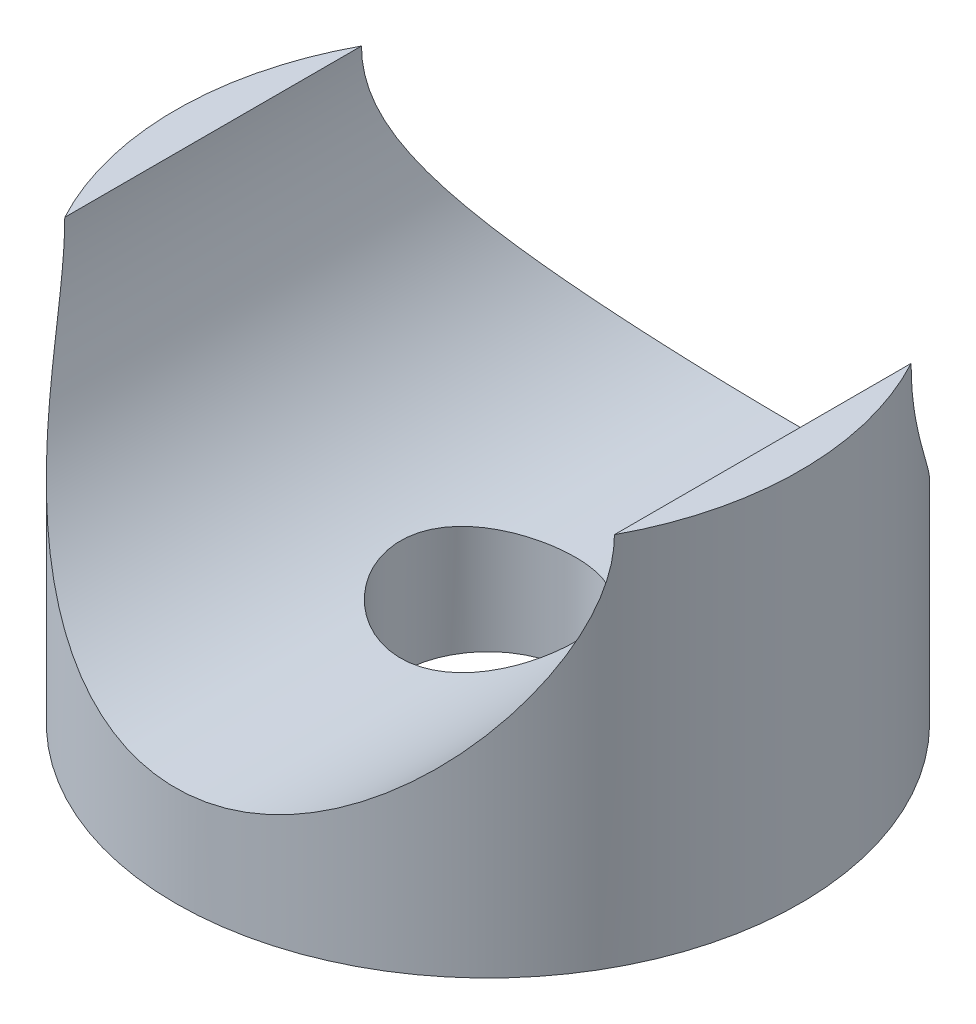
ISO-10303-21;
HEADER;
FILE_DESCRIPTION(('STEP AP214'),'2;1');
FILE_NAME('part.step','',(''),(''),'','','');
FILE_SCHEMA(('AUTOMOTIVE_DESIGN { 1 0 10303 214 1 1 1 1 }'));
ENDSEC;
DATA;
#1=APPLICATION_CONTEXT('core data for automotive mechanical design processes');
#2=APPLICATION_PROTOCOL_DEFINITION('international standard','automotive_design',2000,#1);
#3=PRODUCT_CONTEXT('',#1,'mechanical');
#4=PRODUCT('Part','Part','',(#3));
#5=PRODUCT_RELATED_PRODUCT_CATEGORY('part','',(#4));
#6=PRODUCT_DEFINITION_FORMATION('','',#4);
#7=PRODUCT_DEFINITION_CONTEXT('part definition',#1,'design');
#8=PRODUCT_DEFINITION('design','',#6,#7);
#9=PRODUCT_DEFINITION_SHAPE('','',#8);
#10=(LENGTH_UNIT() NAMED_UNIT(*) SI_UNIT(.MILLI.,.METRE.));
#11=(NAMED_UNIT(*) PLANE_ANGLE_UNIT() SI_UNIT($,.RADIAN.));
#12=(NAMED_UNIT(*) SI_UNIT($,.STERADIAN.) SOLID_ANGLE_UNIT());
#13=UNCERTAINTY_MEASURE_WITH_UNIT(LENGTH_MEASURE(1.E-05),#10,'distance_accuracy_value','');
#14=(GEOMETRIC_REPRESENTATION_CONTEXT(3) GLOBAL_UNCERTAINTY_ASSIGNED_CONTEXT((#13)) GLOBAL_UNIT_ASSIGNED_CONTEXT((#10,
#11,#12)) REPRESENTATION_CONTEXT('',''));
#15=CARTESIAN_POINT('',(0.,0.,0.));
#16=DIRECTION('',(0.,0.,1.));
#17=DIRECTION('',(1.,0.,0.));
#18=AXIS2_PLACEMENT_3D('',#15,#16,#17);
#19=CARTESIAN_POINT('',(0.,15.,0.));
#20=DIRECTION('',(0.,1.,0.));
#21=DIRECTION('',(0.,0.,1.));
#22=AXIS2_PLACEMENT_3D('',#19,#20,#21);
#23=PLANE('',#22);
#24=CARTESIAN_POINT('',(0.,15.,0.));
#25=DIRECTION('',(0.,1.,0.));
#26=DIRECTION('',(0.,0.,1.));
#27=AXIS2_PLACEMENT_3D('',#24,#25,#26);
#28=CIRCLE('',#27,12.5);
#29=CARTESIAN_POINT('',(11.,15.,5.93717104351896));
#30=VERTEX_POINT('',#29);
#31=CARTESIAN_POINT('',(11.,15.,-5.93717104351896));
#32=VERTEX_POINT('',#31);
#33=EDGE_CURVE('E11',#30,#32,#28,.T.);
#34=ORIENTED_EDGE('',*,*,#33,.T.);
#35=DIRECTION('',(0.,0.,-1.));
#36=VECTOR('',#35,1.);
#37=CARTESIAN_POINT('',(11.,15.,22.));
#38=LINE('',#37,#36);
#39=EDGE_CURVE('E67',#32,#30,#38,.F.);
#40=ORIENTED_EDGE('',*,*,#39,.T.);
#41=EDGE_LOOP('',(#34,#40));
#42=FACE_BOUND('',#41,.T.);
#43=ADVANCED_FACE('F43',(#42),#23,.T.);
#44=CARTESIAN_POINT('',(-11.,15.,-5.93717104351896));
#45=VERTEX_POINT('',#44);
#46=CARTESIAN_POINT('',(-11.,15.,5.93717104351896));
#47=VERTEX_POINT('',#46);
#48=EDGE_CURVE('E59',#45,#47,#28,.T.);
#49=ORIENTED_EDGE('',*,*,#48,.T.);
#50=DIRECTION('',(0.,0.,-1.));
#51=VECTOR('',#50,1.);
#52=CARTESIAN_POINT('',(-11.,15.,22.));
#53=LINE('',#52,#51);
#54=EDGE_CURVE('E79',#47,#45,#53,.T.);
#55=ORIENTED_EDGE('',*,*,#54,.T.);
#56=EDGE_LOOP('',(#49,#55));
#57=FACE_BOUND('',#56,.T.);
#58=ADVANCED_FACE('F87',(#57),#23,.T.);
#59=CARTESIAN_POINT('',(0.,15.,0.));
#60=DIRECTION('',(0.,-1.,0.));
#61=DIRECTION('',(0.,0.,-1.));
#62=AXIS2_PLACEMENT_3D('',#59,#60,#61);
#63=CYLINDRICAL_SURFACE('',#62,12.5);
#64=CARTESIAN_POINT('',(0.,0.,0.));
#65=DIRECTION('',(0.,1.,0.));
#66=DIRECTION('',(0.,0.,1.));
#67=AXIS2_PLACEMENT_3D('',#64,#65,#66);
#68=CIRCLE('',#67,12.5);
#69=CARTESIAN_POINT('',(0.,0.,12.5));
#70=VERTEX_POINT('',#69);
#71=EDGE_CURVE('E91',#70,#70,#68,.T.);
#72=ORIENTED_EDGE('',*,*,#71,.T.);
#73=EDGE_LOOP('',(#72));
#74=FACE_BOUND('',#73,.T.);
#75=CARTESIAN_POINT('',(-11.,15.,5.93717104351896));
#76=CARTESIAN_POINT('',(-11.0000435491848,14.8231963740313,5.93701480647454));
#77=CARTESIAN_POINT('',(-10.9957394278329,14.6464972505732,5.94506501443922));
#78=CARTESIAN_POINT('',(-10.978794113798,14.2952603105016,5.9763390350787));
#79=CARTESIAN_POINT('',(-10.9661729018585,14.1207183328762,5.99952648123605));
#80=CARTESIAN_POINT('',(-10.9332301828328,13.7778178667968,6.05933530603669));
#81=CARTESIAN_POINT('',(-10.9130428218675,13.6094047145475,6.09572231769166));
#82=CARTESIAN_POINT('',(-10.8654430284725,13.2765056799291,6.18017089159592));
#83=CARTESIAN_POINT('',(-10.8380257408056,13.1120225179928,6.22824029741824));
#84=CARTESIAN_POINT('',(-10.762282729134,12.7127558286128,6.35855617523171));
#85=CARTESIAN_POINT('',(-10.7101442109561,12.4805059049969,6.44634426789699));
#86=CARTESIAN_POINT('',(-10.5929007795773,12.0258364614429,6.63724370069664));
#87=CARTESIAN_POINT('',(-10.5277895012978,11.8034218329068,6.74036255653404));
#88=CARTESIAN_POINT('',(-10.384939972937,11.3659302882372,6.95846028843818));
#89=CARTESIAN_POINT('',(-10.3070890719427,11.1509417070036,7.07354128529206));
#90=CARTESIAN_POINT('',(-10.139850569859,10.7297812749366,7.31126526074988));
#91=CARTESIAN_POINT('',(-10.050458840515,10.5236126143707,7.43391093706697));
#92=CARTESIAN_POINT('',(-9.80282059098369,9.99662903659116,7.76004467010912));
#93=CARTESIAN_POINT('',(-9.63574808523731,9.68229781772335,7.96735950504635));
#94=CARTESIAN_POINT('',(-9.27349262528408,9.07312056731753,8.38625220512432));
#95=CARTESIAN_POINT('',(-9.07829420982559,8.77828538396625,8.59783235959349));
#96=CARTESIAN_POINT('',(-8.66037526751816,8.2086593907299,9.01862601592675));
#97=CARTESIAN_POINT('',(-8.43773195277447,7.93381565622621,9.22784442811798));
#98=CARTESIAN_POINT('',(-7.9642593638125,7.40416944398284,9.63944686839564));
#99=CARTESIAN_POINT('',(-7.71344302348163,7.14935786032474,9.84183397759935));
#100=CARTESIAN_POINT('',(-7.2449534569965,6.7182706903141,10.1894477318693));
#101=CARTESIAN_POINT('',(-7.03313492252062,6.53751073199463,10.3370228897678));
#102=CARTESIAN_POINT('',(-6.59264149616064,6.19001935230412,10.6233735041356));
#103=CARTESIAN_POINT('',(-6.36396701088037,6.02328759274868,10.7621491727183));
#104=CARTESIAN_POINT('',(-5.89020476887657,5.70555278088621,11.0285661451754));
#105=CARTESIAN_POINT('',(-5.64513478893277,5.55453313270944,11.1562191736512));
#106=CARTESIAN_POINT('',(-5.1388866978297,5.26983439811367,11.3982677545015));
#107=CARTESIAN_POINT('',(-4.87771190275705,5.13615175936646,11.5126660222437));
#108=CARTESIAN_POINT('',(-4.39105348220123,4.91157740142622,11.7057095692011));
#109=CARTESIAN_POINT('',(-4.16815347166375,4.81737345401144,11.7870257639768));
#110=CARTESIAN_POINT('',(-3.71323053378648,4.64281675696217,11.9381462305545));
#111=CARTESIAN_POINT('',(-3.48120950448291,4.56246114410423,12.0079528818918));
#112=CARTESIAN_POINT('',(-3.00920471742103,4.41672718587182,12.1348415554404));
#113=CARTESIAN_POINT('',(-2.76922413316132,4.3513429516249,12.1919285805767));
#114=CARTESIAN_POINT('',(-2.28262544464057,4.23653861410476,12.2923279089154));
#115=CARTESIAN_POINT('',(-2.03600726736718,4.18711868651389,12.3356400605294));
#116=CARTESIAN_POINT('',(-1.53648632802077,4.10488068347091,12.4077891952074));
#117=CARTESIAN_POINT('',(-1.28355641073304,4.07215565436632,12.4365450443079));
#118=CARTESIAN_POINT('',(-0.774747345523032,4.02434267017076,12.478578588679));
#119=CARTESIAN_POINT('',(-0.518868190777122,4.00925475589488,12.4918562481306));
#120=CARTESIAN_POINT('',(-0.00639418896902495,3.99701660530965,12.5026251315283));
#121=CARTESIAN_POINT('',(0.250200521701966,3.99986315678138,12.5001191824561));
#122=CARTESIAN_POINT('',(0.761915803582656,4.02343052619053,12.4793848267302));
#123=CARTESIAN_POINT('',(1.01703645636061,4.0441503453721,12.4611572985963));
#124=CARTESIAN_POINT('',(1.5014050994174,4.1004624708174,12.4116782243066));
#125=CARTESIAN_POINT('',(1.73095807798654,4.1345892986022,12.3817106547532));
#126=CARTESIAN_POINT('',(2.18566751332125,4.21685315169593,12.3095842481608));
#127=CARTESIAN_POINT('',(2.4108224647305,4.26499488736904,12.2674213123303));
#128=CARTESIAN_POINT('',(2.8553188576051,4.37458012683823,12.1716407723087));
#129=CARTESIAN_POINT('',(3.07466139915679,4.43602109307806,12.1180253533313));
#130=CARTESIAN_POINT('',(3.50658864862711,4.57142908978597,12.0001658687681));
#131=CARTESIAN_POINT('',(3.71917078385711,4.64540082269004,11.9359178132694));
#132=CARTESIAN_POINT('',(4.15032472782886,4.81022640250744,11.7932044916311));
#133=CARTESIAN_POINT('',(4.3683785032998,4.90186811916921,11.7140840832595));
#134=CARTESIAN_POINT('',(4.79505583914701,5.09734511888616,11.5459991304037));
#135=CARTESIAN_POINT('',(5.00367566811059,5.20118516932981,11.4570307378912));
#136=CARTESIAN_POINT('',(5.61439319479867,5.52941509161469,11.1771558462296));
#137=CARTESIAN_POINT('',(6.00168356205419,5.77064498469977,10.9731660195994));
#138=CARTESIAN_POINT('',(6.64576213387497,6.22786570775441,10.5919076948715));
#139=CARTESIAN_POINT('',(6.91153754197295,6.43597765019494,10.4200084610743));
#140=CARTESIAN_POINT('',(7.41893115232441,6.87157894115338,10.0650511415273));
#141=CARTESIAN_POINT('',(7.66053819536721,7.0990771518963,9.88198796329127));
#142=CARTESIAN_POINT('',(8.12066982604148,7.5727306341778,9.50753177585124));
#143=CARTESIAN_POINT('',(8.33907712915631,7.81897081552667,9.31610276297448));
#144=CARTESIAN_POINT('',(8.75172578082956,8.32807080372833,8.92956674849573));
#145=CARTESIAN_POINT('',(8.94597310913508,8.59092647375304,8.73446067081225));
#146=CARTESIAN_POINT('',(9.31480114701414,9.13942868883256,8.34020361345404));
#147=CARTESIAN_POINT('',(9.4888164923304,9.42546417404346,8.14106460398763));
#148=CARTESIAN_POINT('',(9.81177208875224,10.0157820869052,7.74878373808024));
#149=CARTESIAN_POINT('',(9.9606908252093,10.3200798703606,7.55564714185087));
#150=CARTESIAN_POINT('',(10.2315631185655,10.9464853337874,7.18453207936222));
#151=CARTESIAN_POINT('',(10.3536763979216,11.2684723858369,7.00646794014411));
#152=CARTESIAN_POINT('',(10.5698551828954,11.934040746979,6.67585009659599));
#153=CARTESIAN_POINT('',(10.6639807692949,12.2775738539826,6.52324205997916));
#154=CARTESIAN_POINT('',(10.7763807529574,12.7875727990385,6.33436517963392));
#155=CARTESIAN_POINT('',(10.8075345121292,12.9449080508807,6.28095090277509));
#156=CARTESIAN_POINT('',(10.8633209949829,13.2637832582038,6.18396071332855));
#157=CARTESIAN_POINT('',(10.8879532450571,13.4253235181274,6.1403855153123));
#158=CARTESIAN_POINT('',(10.9301348719976,13.7513749817822,6.06498341969368));
#159=CARTESIAN_POINT('',(10.9477118090663,13.9158719500867,6.0331108505262));
#160=CARTESIAN_POINT('',(10.9754841623787,14.2474248996859,5.98244067386023));
#161=CARTESIAN_POINT('',(10.9856850512354,14.4144788896446,5.96363337307516));
#162=CARTESIAN_POINT('',(10.9947017723072,14.6516017061204,5.94697868980837));
#163=CARTESIAN_POINT('',(10.9966865741065,14.7211854452357,5.94330663308279));
#164=CARTESIAN_POINT('',(10.9993362647877,14.8605093186388,5.93840112585429));
#165=CARTESIAN_POINT('',(11.0000002906072,14.930249525397,5.93716926990515));
#166=CARTESIAN_POINT('',(11.,15.,5.93717104351896));
#167=B_SPLINE_CURVE_WITH_KNOTS('',3,(#75,#76,#77,#78,#79,#80,#81,#82,#83,#84,#85,#86,#87,#88,
#89,#90,#91,#92,#93,#94,#95,#96,#97,#98,#99,#100,#101,#102,#103,#104,#105,#106,#107,#108,#109,
#110,#111,#112,#113,#114,#115,#116,#117,#118,#119,#120,#121,#122,#123,#124,#125,#126,#127,#128,
#129,#130,#131,#132,#133,#134,#135,#136,#137,#138,#139,#140,#141,#142,#143,#144,#145,#146,#147,
#148,#149,#150,#151,#152,#153,#154,#155,#156,#157,#158,#159,#160,#161,#162,#163,#164,#165,#166),
.UNSPECIFIED.,.F.,.F.,(4,2,2,2,2,2,2,2,2,2,2,2,2,2,2,2,2,2,2,2,2,2,2,2,2,2,2,2,2,2,2,2,2,2,2,2,
2,2,2,2,2,2,2,2,2,4),(0.,0.530008476842966,1.05874829560737,1.57852597364669,2.09865359982355,
2.85847017833458,3.61866048265958,4.38597728606578,5.15356932983295,6.38771902196553,
7.62254975223529,8.85398253411438,10.0848522733822,11.0295112609836,11.9741474687163,
12.9177755553533,13.8612099874469,14.6263379889138,15.3913076054463,16.1559758084013,
16.9206524260116,17.6895455222968,18.4584403979199,19.2271975616937,19.9959117702,
20.6971350164334,21.3985942141104,22.0999196878422,22.8015089342509,23.5489985185074,
24.2967812168822,25.7912267611665,26.9263226022635,28.0619401528793,29.2030498771487,
30.3438766051017,31.5113511916482,32.6798215869919,33.8411282450495,34.9999236398127,
35.5067035363214,36.013520226321,36.5183374052959,37.0227796529262,37.2318603246143,
37.4410775754506),.UNSPECIFIED.);
#168=EDGE_CURVE('E72',#47,#30,#167,.T.);
#169=ORIENTED_EDGE('',*,*,#168,.F.);
#170=ORIENTED_EDGE('',*,*,#48,.F.);
#171=CARTESIAN_POINT('',(11.,15.,-5.93717104351896));
#172=CARTESIAN_POINT('',(11.0000435491848,14.8231963740313,-5.93701480647454));
#173=CARTESIAN_POINT('',(10.9957394278329,14.6464972505732,-5.94506501443922));
#174=CARTESIAN_POINT('',(10.978794113798,14.2952603105016,-5.9763390350787));
#175=CARTESIAN_POINT('',(10.9661729018585,14.1207183328762,-5.99952648123605));
#176=CARTESIAN_POINT('',(10.9332301828328,13.7778178667968,-6.05933530603669));
#177=CARTESIAN_POINT('',(10.9130428218675,13.6094047145475,-6.09572231769166));
#178=CARTESIAN_POINT('',(10.8654430284725,13.2765056799291,-6.18017089159592));
#179=CARTESIAN_POINT('',(10.8380257408056,13.1120225179928,-6.22824029741824));
#180=CARTESIAN_POINT('',(10.762282729134,12.7127558286128,-6.35855617523171));
#181=CARTESIAN_POINT('',(10.7101442109561,12.4805059049969,-6.44634426789699));
#182=CARTESIAN_POINT('',(10.5929007795773,12.0258364614429,-6.63724370069664));
#183=CARTESIAN_POINT('',(10.5277895012978,11.8034218329068,-6.74036255653404));
#184=CARTESIAN_POINT('',(10.384939972937,11.3659302882372,-6.95846028843818));
#185=CARTESIAN_POINT('',(10.3070890719427,11.1509417070036,-7.07354128529206));
#186=CARTESIAN_POINT('',(10.139850569859,10.7297812749366,-7.31126526074988));
#187=CARTESIAN_POINT('',(10.050458840515,10.5236126143707,-7.43391093706697));
#188=CARTESIAN_POINT('',(9.80282059098369,9.99662903659116,-7.76004467010912));
#189=CARTESIAN_POINT('',(9.63574808523731,9.68229781772335,-7.96735950504635));
#190=CARTESIAN_POINT('',(9.27349262528408,9.07312056731753,-8.38625220512432));
#191=CARTESIAN_POINT('',(9.07829420982559,8.77828538396625,-8.59783235959349));
#192=CARTESIAN_POINT('',(8.66037526751816,8.2086593907299,-9.01862601592675));
#193=CARTESIAN_POINT('',(8.43773195277447,7.93381565622621,-9.22784442811798));
#194=CARTESIAN_POINT('',(7.9642593638125,7.40416944398284,-9.63944686839564));
#195=CARTESIAN_POINT('',(7.71344302348163,7.14935786032474,-9.84183397759935));
#196=CARTESIAN_POINT('',(7.2449534569965,6.7182706903141,-10.1894477318693));
#197=CARTESIAN_POINT('',(7.03313492252062,6.53751073199463,-10.3370228897678));
#198=CARTESIAN_POINT('',(6.59264149616064,6.19001935230412,-10.6233735041356));
#199=CARTESIAN_POINT('',(6.36396701088037,6.02328759274868,-10.7621491727183));
#200=CARTESIAN_POINT('',(5.89020476887657,5.70555278088621,-11.0285661451754));
#201=CARTESIAN_POINT('',(5.64513478893277,5.55453313270944,-11.1562191736512));
#202=CARTESIAN_POINT('',(5.1388866978297,5.26983439811367,-11.3982677545015));
#203=CARTESIAN_POINT('',(4.87771190275705,5.13615175936646,-11.5126660222437));
#204=CARTESIAN_POINT('',(4.39105348220123,4.91157740142622,-11.7057095692011));
#205=CARTESIAN_POINT('',(4.16815347166375,4.81737345401144,-11.7870257639768));
#206=CARTESIAN_POINT('',(3.71323053378648,4.64281675696217,-11.9381462305545));
#207=CARTESIAN_POINT('',(3.48120950448291,4.56246114410423,-12.0079528818918));
#208=CARTESIAN_POINT('',(3.00920471742103,4.41672718587182,-12.1348415554404));
#209=CARTESIAN_POINT('',(2.76922413316132,4.3513429516249,-12.1919285805767));
#210=CARTESIAN_POINT('',(2.28262544464057,4.23653861410476,-12.2923279089154));
#211=CARTESIAN_POINT('',(2.03600726736718,4.18711868651389,-12.3356400605294));
#212=CARTESIAN_POINT('',(1.53648632802077,4.10488068347091,-12.4077891952074));
#213=CARTESIAN_POINT('',(1.28355641073304,4.07215565436632,-12.4365450443079));
#214=CARTESIAN_POINT('',(0.774747345523032,4.02434267017076,-12.478578588679));
#215=CARTESIAN_POINT('',(0.518868190777122,4.00925475589488,-12.4918562481306));
#216=CARTESIAN_POINT('',(0.00639418896902495,3.99701660530965,-12.5026251315283));
#217=CARTESIAN_POINT('',(-0.250200521701966,3.99986315678138,-12.5001191824561));
#218=CARTESIAN_POINT('',(-0.761915803582656,4.02343052619053,-12.4793848267302));
#219=CARTESIAN_POINT('',(-1.01703645636061,4.0441503453721,-12.4611572985963));
#220=CARTESIAN_POINT('',(-1.5014050994174,4.1004624708174,-12.4116782243066));
#221=CARTESIAN_POINT('',(-1.73095807798654,4.1345892986022,-12.3817106547532));
#222=CARTESIAN_POINT('',(-2.18566751332125,4.21685315169593,-12.3095842481608));
#223=CARTESIAN_POINT('',(-2.4108224647305,4.26499488736904,-12.2674213123303));
#224=CARTESIAN_POINT('',(-2.8553188576051,4.37458012683823,-12.1716407723087));
#225=CARTESIAN_POINT('',(-3.07466139915679,4.43602109307806,-12.1180253533313));
#226=CARTESIAN_POINT('',(-3.50658864862711,4.57142908978597,-12.0001658687681));
#227=CARTESIAN_POINT('',(-3.71917078385711,4.64540082269004,-11.9359178132694));
#228=CARTESIAN_POINT('',(-4.15032472782886,4.81022640250744,-11.7932044916311));
#229=CARTESIAN_POINT('',(-4.3683785032998,4.90186811916921,-11.7140840832595));
#230=CARTESIAN_POINT('',(-4.79505583914701,5.09734511888616,-11.5459991304037));
#231=CARTESIAN_POINT('',(-5.00367566811059,5.20118516932981,-11.4570307378912));
#232=CARTESIAN_POINT('',(-5.61439319479867,5.52941509161469,-11.1771558462296));
#233=CARTESIAN_POINT('',(-6.00168356205419,5.77064498469977,-10.9731660195994));
#234=CARTESIAN_POINT('',(-6.64576213387497,6.22786570775441,-10.5919076948715));
#235=CARTESIAN_POINT('',(-6.91153754197295,6.43597765019494,-10.4200084610743));
#236=CARTESIAN_POINT('',(-7.41893115232441,6.87157894115338,-10.0650511415273));
#237=CARTESIAN_POINT('',(-7.66053819536721,7.0990771518963,-9.88198796329127));
#238=CARTESIAN_POINT('',(-8.12066982604148,7.5727306341778,-9.50753177585124));
#239=CARTESIAN_POINT('',(-8.33907712915631,7.81897081552667,-9.31610276297448));
#240=CARTESIAN_POINT('',(-8.75172578082956,8.32807080372833,-8.92956674849573));
#241=CARTESIAN_POINT('',(-8.94597310913508,8.59092647375304,-8.73446067081225));
#242=CARTESIAN_POINT('',(-9.31480114701414,9.13942868883256,-8.34020361345404));
#243=CARTESIAN_POINT('',(-9.4888164923304,9.42546417404346,-8.14106460398763));
#244=CARTESIAN_POINT('',(-9.81177208875224,10.0157820869052,-7.74878373808024));
#245=CARTESIAN_POINT('',(-9.9606908252093,10.3200798703606,-7.55564714185087));
#246=CARTESIAN_POINT('',(-10.2315631185655,10.9464853337874,-7.18453207936222));
#247=CARTESIAN_POINT('',(-10.3536763979216,11.2684723858369,-7.00646794014411));
#248=CARTESIAN_POINT('',(-10.5698551828954,11.934040746979,-6.67585009659599));
#249=CARTESIAN_POINT('',(-10.6639807692949,12.2775738539826,-6.52324205997916));
#250=CARTESIAN_POINT('',(-10.7763807529574,12.7875727990385,-6.33436517963392));
#251=CARTESIAN_POINT('',(-10.8075345121292,12.9449080508807,-6.28095090277509));
#252=CARTESIAN_POINT('',(-10.8633209949829,13.2637832582038,-6.18396071332855));
#253=CARTESIAN_POINT('',(-10.8879532450571,13.4253235181274,-6.1403855153123));
#254=CARTESIAN_POINT('',(-10.9301348719976,13.7513749817822,-6.06498341969368));
#255=CARTESIAN_POINT('',(-10.9477118090663,13.9158719500867,-6.0331108505262));
#256=CARTESIAN_POINT('',(-10.9754841623787,14.2474248996859,-5.98244067386023));
#257=CARTESIAN_POINT('',(-10.9856850512354,14.4144788896446,-5.96363337307516));
#258=CARTESIAN_POINT('',(-10.9947017723072,14.6516017061204,-5.94697868980837));
#259=CARTESIAN_POINT('',(-10.9966865741065,14.7211854452357,-5.94330663308279));
#260=CARTESIAN_POINT('',(-10.9993362647877,14.8605093186388,-5.93840112585429));
#261=CARTESIAN_POINT('',(-11.0000002906072,14.930249525397,-5.93716926990515));
#262=CARTESIAN_POINT('',(-11.,15.,-5.93717104351896));
#263=B_SPLINE_CURVE_WITH_KNOTS('',3,(#171,#172,#173,#174,#175,#176,#177,#178,#179,#180,#181,
#182,#183,#184,#185,#186,#187,#188,#189,#190,#191,#192,#193,#194,#195,#196,#197,#198,#199,#200,
#201,#202,#203,#204,#205,#206,#207,#208,#209,#210,#211,#212,#213,#214,#215,#216,#217,#218,#219,
#220,#221,#222,#223,#224,#225,#226,#227,#228,#229,#230,#231,#232,#233,#234,#235,#236,#237,#238,
#239,#240,#241,#242,#243,#244,#245,#246,#247,#248,#249,#250,#251,#252,#253,#254,#255,#256,#257,
#258,#259,#260,#261,#262),.UNSPECIFIED.,.F.,.F.,(4,2,2,2,2,2,2,2,2,2,2,2,2,2,2,2,2,2,2,2,2,2,2,
2,2,2,2,2,2,2,2,2,2,2,2,2,2,2,2,2,2,2,2,2,2,4),(0.,0.530008476842966,1.05874829560737,
1.57852597364669,2.09865359982355,2.85847017833458,3.61866048265958,4.38597728606578,
5.15356932983295,6.38771902196553,7.62254975223529,8.85398253411438,10.0848522733822,
11.0295112609836,11.9741474687163,12.9177755553533,13.8612099874469,14.6263379889138,
15.3913076054463,16.1559758084013,16.9206524260116,17.6895455222968,18.4584403979199,
19.2271975616937,19.9959117702,20.6971350164334,21.3985942141104,22.0999196878422,
22.8015089342509,23.5489985185074,24.2967812168822,25.7912267611665,26.9263226022635,
28.0619401528793,29.2030498771487,30.3438766051017,31.5113511916482,32.6798215869919,
33.8411282450495,34.9999236398127,35.5067035363214,36.013520226321,36.5183374052959,
37.0227796529262,37.2318603246143,37.4410775754506),.UNSPECIFIED.);
#264=EDGE_CURVE('E76',#32,#45,#263,.T.);
#265=ORIENTED_EDGE('',*,*,#264,.F.);
#266=ORIENTED_EDGE('',*,*,#33,.F.);
#267=EDGE_LOOP('',(#169,#170,#265,#266));
#268=FACE_BOUND('',#267,.T.);
#269=ADVANCED_FACE('F45',(#74,#268),#63,.T.);
#270=CARTESIAN_POINT('',(0.,15.,0.));
#271=DIRECTION('',(0.,-1.,0.));
#272=DIRECTION('',(0.,0.,-1.));
#273=AXIS2_PLACEMENT_3D('',#270,#271,#272);
#274=CYLINDRICAL_SURFACE('',#273,3.5);
#275=CARTESIAN_POINT('',(0.,0.,0.));
#276=DIRECTION('',(0.,1.,0.));
#277=DIRECTION('',(0.,0.,1.));
#278=AXIS2_PLACEMENT_3D('',#275,#276,#277);
#279=CIRCLE('',#278,3.5);
#280=CARTESIAN_POINT('',(0.,0.,3.5));
#281=VERTEX_POINT('',#280);
#282=EDGE_CURVE('E94',#281,#281,#279,.T.);
#283=ORIENTED_EDGE('',*,*,#282,.F.);
#284=EDGE_LOOP('',(#283));
#285=FACE_BOUND('',#284,.T.);
#286=CARTESIAN_POINT('',(0.,4.,-3.5));
#287=CARTESIAN_POINT('',(-0.191453913002362,4.00000059219315,-3.49999928790939));
#288=CARTESIAN_POINT('',(-0.382916032199188,4.00504524784357,-3.48423928645049));
#289=CARTESIAN_POINT('',(-0.760230252821131,4.02467444928121,-3.42178826758474));
#290=CARTESIAN_POINT('',(-0.946081263052845,4.03926083830809,-3.37509127385247));
#291=CARTESIAN_POINT('',(-1.30667823118059,4.07638231382931,-3.2525081948892));
#292=CARTESIAN_POINT('',(-1.48144124258375,4.09890482664354,-3.17666826546));
#293=CARTESIAN_POINT('',(-1.81576928638995,4.14958022051305,-2.99815179135585));
#294=CARTESIAN_POINT('',(-1.97533175054435,4.17773405054046,-2.89547072259905));
#295=CARTESIAN_POINT('',(-2.27981886449525,4.23769474829485,-2.66274146275306));
#296=CARTESIAN_POINT('',(-2.42419094844221,4.26958335631454,-2.53199148313673));
#297=CARTESIAN_POINT('',(-2.68937247099284,4.33295256096986,-2.24832954785994));
#298=CARTESIAN_POINT('',(-2.81017731679953,4.36443307696259,-2.09541328252152));
#299=CARTESIAN_POINT('',(-3.02783317045942,4.42430473241928,-1.76692511533895));
#300=CARTESIAN_POINT('',(-3.12398644251492,4.4525953183532,-1.59087082078168));
#301=CARTESIAN_POINT('',(-3.28508911759285,4.50165094132673,-1.22404489379331));
#302=CARTESIAN_POINT('',(-3.35004708428231,4.52241804331175,-1.03327731712904));
#303=CARTESIAN_POINT('',(-3.44487966364376,4.55321885082503,-0.648688744174349));
#304=CARTESIAN_POINT('',(-3.47578213240987,4.56356615467433,-0.455147025390738));
#305=CARTESIAN_POINT('',(-3.50483828478712,4.5732859865081,-0.0653706049266485));
#306=CARTESIAN_POINT('',(-3.50300104371316,4.57266155581361,0.130863335410679));
#307=CARTESIAN_POINT('',(-3.46743227634777,4.56078475207685,0.51188238899974));
#308=CARTESIAN_POINT('',(-3.43501645777888,4.54997082516136,0.696806312592749));
#309=CARTESIAN_POINT('',(-3.34134743785713,4.51964713261447,1.05844078008403));
#310=CARTESIAN_POINT('',(-3.28009106898956,4.50013641183969,1.23515041947688));
#311=CARTESIAN_POINT('',(-3.12956898264447,4.45428784532312,1.57843557015595));
#312=CARTESIAN_POINT('',(-3.03989639785128,4.4278518610435,1.74481900912107));
#313=CARTESIAN_POINT('',(-2.83536986459916,4.37117537033743,2.06060427297046));
#314=CARTESIAN_POINT('',(-2.72050917495591,4.34093384634564,2.2100015354978));
#315=CARTESIAN_POINT('',(-2.46244727091673,4.27830385155413,2.49500010714658));
#316=CARTESIAN_POINT('',(-2.31816264695117,4.24588148430521,2.62961481536966));
#317=CARTESIAN_POINT('',(-2.0086640911352,4.18380163404398,2.8729818788072));
#318=CARTESIAN_POINT('',(-1.843448494536,4.15414437128082,2.9817321749091));
#319=CARTESIAN_POINT('',(-1.49482566734696,4.10060495086755,3.17098495315358));
#320=CARTESIAN_POINT('',(-1.31127826852939,4.07677299673154,3.25124439792856));
#321=CARTESIAN_POINT('',(-0.932351413270409,4.03793226227225,3.37945133253228));
#322=CARTESIAN_POINT('',(-0.736975708180217,4.02292070056072,3.4274090089738));
#323=CARTESIAN_POINT('',(-0.34830681058327,4.00386324517333,3.48795254179042));
#324=CARTESIAN_POINT('',(-0.155241546756458,3.99940373374241,3.50187333997931));
#325=CARTESIAN_POINT('',(0.230491340684903,4.00072496041059,3.49772218206574));
#326=CARTESIAN_POINT('',(0.423159020302228,4.0065041414289,3.47965509062076));
#327=CARTESIAN_POINT('',(0.797426852518825,4.02738122305606,3.41310880388518));
#328=CARTESIAN_POINT('',(0.979184452643686,4.04223351815865,3.36543062043069));
#329=CARTESIAN_POINT('',(1.33206391392053,4.07950944432903,3.24199936341441));
#330=CARTESIAN_POINT('',(1.50318444478933,4.10193402014763,3.16624278655445));
#331=CARTESIAN_POINT('',(1.83467888495345,4.15275184920104,2.98669880046353));
#332=CARTESIAN_POINT('',(1.99467863120652,4.18127993879341,2.88225979460126));
#333=CARTESIAN_POINT('',(2.29532575637424,4.24104960355669,2.64909287591225));
#334=CARTESIAN_POINT('',(2.43596768623804,4.27229193874273,2.52035814814092));
#335=CARTESIAN_POINT('',(2.69992209437255,4.33559109682494,2.2359741122771));
#336=CARTESIAN_POINT('',(2.8222826221462,4.36762849050489,2.07943486835046));
#337=CARTESIAN_POINT('',(3.03909223585892,4.4275540196554,1.74735030645305));
#338=CARTESIAN_POINT('',(3.1335416064073,4.45544219743397,1.57180518230966));
#339=CARTESIAN_POINT('',(3.29129494520542,4.50361022246499,1.20694919164213));
#340=CARTESIAN_POINT('',(3.35470599093836,4.52391616891868,1.01768827486658));
#341=CARTESIAN_POINT('',(3.44851615626464,4.55441639329886,0.630391954677438));
#342=CARTESIAN_POINT('',(3.47892843865088,4.56461470289429,0.43236008272038));
#343=CARTESIAN_POINT('',(3.50491009302244,4.57331442733432,0.0431245671302223));
#344=CARTESIAN_POINT('',(3.50204590682579,4.57234172715402,-0.147964019519329));
#345=CARTESIAN_POINT('',(3.46535708555006,4.56009263756677,-0.526791893543842));
#346=CARTESIAN_POINT('',(3.43153399578016,4.54881676244134,-0.714531347613431));
#347=CARTESIAN_POINT('',(3.33495272149925,4.51760591748416,-1.07841757052621));
#348=CARTESIAN_POINT('',(3.2726584728025,4.49781007077961,-1.25470031855306));
#349=CARTESIAN_POINT('',(3.12127100811676,4.45182969941087,-1.59445145003424));
#350=CARTESIAN_POINT('',(3.03217220007286,4.42564384185719,-1.75791715057469));
#351=CARTESIAN_POINT('',(2.82550242469872,4.36851584595114,-2.07453687568278));
#352=CARTESIAN_POINT('',(2.70692761902352,4.3374244191817,-2.22700862617607));
#353=CARTESIAN_POINT('',(2.44641946732529,4.274658108721,-2.51039718451028));
#354=CARTESIAN_POINT('',(2.30447978128004,4.24298306874472,-2.64130812251826));
#355=CARTESIAN_POINT('',(1.99541652380716,4.18131492020979,-2.8823622643084));
#356=CARTESIAN_POINT('',(1.82759616459594,4.15141676006367,-2.99163917498297));
#357=CARTESIAN_POINT('',(1.47501898307895,4.09788823378287,-3.18029190118098));
#358=CARTESIAN_POINT('',(1.2902682418832,4.07425562894733,-3.2596784009052));
#359=CARTESIAN_POINT('',(0.923174508765576,4.03737142385121,-3.3811717084729));
#360=CARTESIAN_POINT('',(0.741662848005623,4.02348164664433,-3.42560024823822));
#361=CARTESIAN_POINT('',(0.373435955649729,4.00479664856637,-3.48501149498943));
#362=CARTESIAN_POINT('',(0.186721880601893,3.99999942244368,-3.50000069449036));
#363=CARTESIAN_POINT('',(0.,4.,-3.5));
#364=B_SPLINE_CURVE_WITH_KNOTS('',3,(#286,#287,#288,#289,#290,#291,#292,#293,#294,#295,#296,
#297,#298,#299,#300,#301,#302,#303,#304,#305,#306,#307,#308,#309,#310,#311,#312,#313,#314,#315,
#316,#317,#318,#319,#320,#321,#322,#323,#324,#325,#326,#327,#328,#329,#330,#331,#332,#333,#334,
#335,#336,#337,#338,#339,#340,#341,#342,#343,#344,#345,#346,#347,#348,#349,#350,#351,#352,#353,
#354,#355,#356,#357,#358,#359,#360,#361,#362,#363),.UNSPECIFIED.,.T.,.F.,(4,2,2,2,2,2,2,2,2,2,2,
2,2,2,2,2,2,2,2,2,2,2,2,2,2,2,2,2,2,2,2,2,2,2,2,2,2,2,4),(0.,0.573675196901327,1.14746124716914,
1.72034227112534,2.29331991667559,2.88276682758003,3.47232849573911,4.0770874607909,
4.68168031369869,5.26747827917141,5.85311386634803,6.41464786551566,6.97624355151808,
7.54627411202673,8.11645741848764,8.71360646114705,9.31080302801859,9.91297795763014,
10.5149628976909,11.0929294917955,11.6708081973882,12.2336973779803,12.7966568130488,
13.3736478341028,13.9508009422064,14.5517177051894,15.152628340429,15.7514510527382,
16.3500348142659,16.9205598823465,17.4910564743042,18.0525712091118,18.6142031702934,
19.1984983136091,19.7829522666065,20.3874518981056,20.9917352481768,21.551354748302,
22.1108508167828),.UNSPECIFIED.);
#365=CARTESIAN_POINT('',(0.,4.,-3.5));
#366=VERTEX_POINT('',#365);
#367=EDGE_CURVE('E48',#366,#366,#364,.T.);
#368=ORIENTED_EDGE('',*,*,#367,.T.);
#369=EDGE_LOOP('',(#368));
#370=FACE_BOUND('',#369,.T.);
#371=ADVANCED_FACE('F109',(#285,#370),#274,.F.);
#372=CARTESIAN_POINT('',(0.,0.,0.));
#373=DIRECTION('',(0.,1.,0.));
#374=DIRECTION('',(0.,0.,1.));
#375=AXIS2_PLACEMENT_3D('',#372,#373,#374);
#376=PLANE('',#375);
#377=ORIENTED_EDGE('',*,*,#71,.F.);
#378=EDGE_LOOP('',(#377));
#379=FACE_BOUND('',#378,.T.);
#380=ORIENTED_EDGE('',*,*,#282,.T.);
#381=EDGE_LOOP('',(#380));
#382=FACE_BOUND('',#381,.T.);
#383=ADVANCED_FACE('F107',(#379,#382),#376,.F.);
#384=CARTESIAN_POINT('',(0.,15.,22.));
#385=DIRECTION('',(0.,0.,-1.));
#386=DIRECTION('',(-1.,0.,0.));
#387=AXIS2_PLACEMENT_3D('',#384,#385,#386);
#388=CYLINDRICAL_SURFACE('',#387,11.);
#389=ORIENTED_EDGE('',*,*,#367,.F.);
#390=EDGE_LOOP('',(#389));
#391=FACE_BOUND('',#390,.T.);
#392=ORIENTED_EDGE('',*,*,#168,.T.);
#393=ORIENTED_EDGE('',*,*,#39,.F.);
#394=ORIENTED_EDGE('',*,*,#264,.T.);
#395=ORIENTED_EDGE('',*,*,#54,.F.);
#396=EDGE_LOOP('',(#392,#393,#394,#395));
#397=FACE_BOUND('',#396,.T.);
#398=ADVANCED_FACE('F78',(#391,#397),#388,.F.);
#399=CLOSED_SHELL('',(#43,#58,#269,#371,#383,#398));
#400=MANIFOLD_SOLID_BREP('B2',#399);
#401=ADVANCED_BREP_SHAPE_REPRESENTATION('',(#18,#400),#14);
#402=SHAPE_DEFINITION_REPRESENTATION(#9,#401);
ENDSEC;
END-ISO-10303-21;
